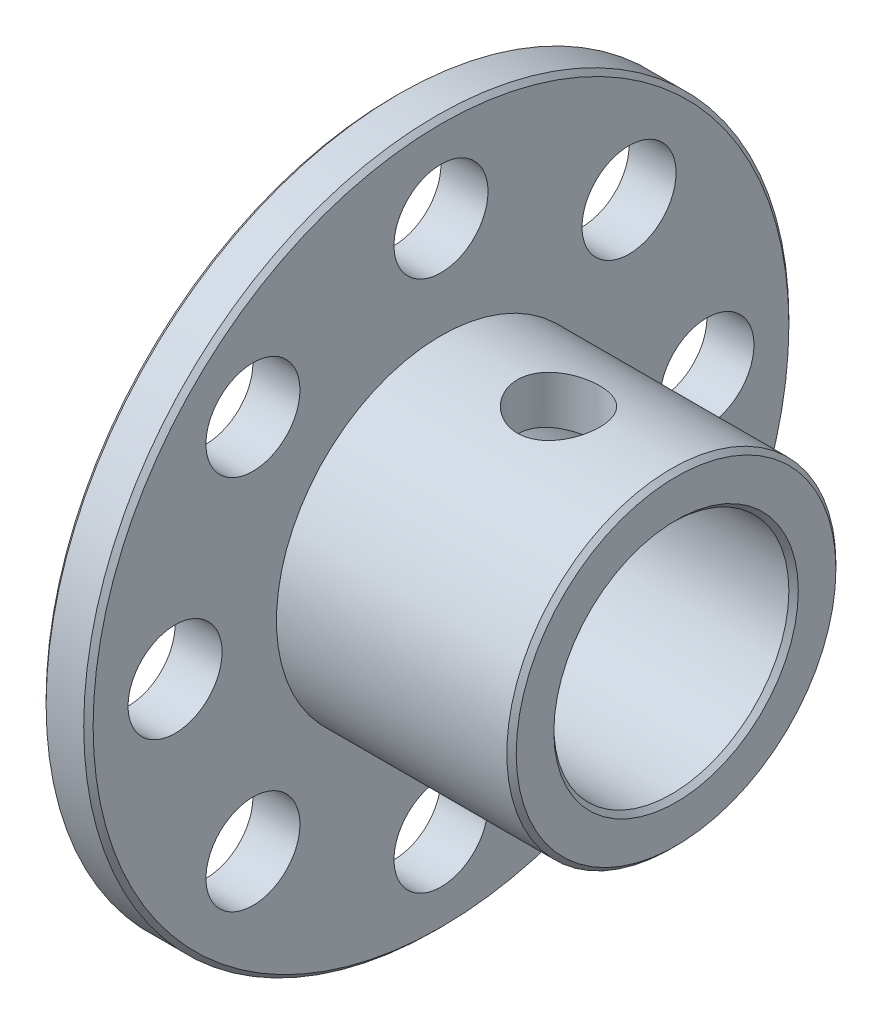
ISO-10303-21;
HEADER;
FILE_DESCRIPTION(('STEP AP214'),'2;1');
FILE_NAME('part.step','',(''),(''),'','','');
FILE_SCHEMA(('AUTOMOTIVE_DESIGN { 1 0 10303 214 1 1 1 1 }'));
ENDSEC;
DATA;
#1=APPLICATION_CONTEXT('core data for automotive mechanical design processes');
#2=APPLICATION_PROTOCOL_DEFINITION('international standard','automotive_design',2000,#1);
#3=PRODUCT_CONTEXT('',#1,'mechanical');
#4=PRODUCT('Part','Part','',(#3));
#5=PRODUCT_RELATED_PRODUCT_CATEGORY('part','',(#4));
#6=PRODUCT_DEFINITION_FORMATION('','',#4);
#7=PRODUCT_DEFINITION_CONTEXT('part definition',#1,'design');
#8=PRODUCT_DEFINITION('design','',#6,#7);
#9=PRODUCT_DEFINITION_SHAPE('','',#8);
#10=(LENGTH_UNIT() NAMED_UNIT(*) SI_UNIT(.MILLI.,.METRE.));
#11=(NAMED_UNIT(*) PLANE_ANGLE_UNIT() SI_UNIT($,.RADIAN.));
#12=(NAMED_UNIT(*) SI_UNIT($,.STERADIAN.) SOLID_ANGLE_UNIT());
#13=UNCERTAINTY_MEASURE_WITH_UNIT(LENGTH_MEASURE(1.E-05),#10,'distance_accuracy_value','');
#14=(GEOMETRIC_REPRESENTATION_CONTEXT(3) GLOBAL_UNCERTAINTY_ASSIGNED_CONTEXT((#13)) GLOBAL_UNIT_ASSIGNED_CONTEXT((#10,
#11,#12)) REPRESENTATION_CONTEXT('',''));
#15=CARTESIAN_POINT('',(0.,0.,0.));
#16=DIRECTION('',(0.,0.,1.));
#17=DIRECTION('',(1.,0.,0.));
#18=AXIS2_PLACEMENT_3D('',#15,#16,#17);
#19=CARTESIAN_POINT('',(12.,0.,0.));
#20=DIRECTION('',(-1.,0.,0.));
#21=DIRECTION('',(0.,0.,1.));
#22=AXIS2_PLACEMENT_3D('',#19,#20,#21);
#23=CYLINDRICAL_SURFACE('',#22,7.);
#24=CARTESIAN_POINT('',(11.8,0.,0.));
#25=DIRECTION('',(1.,0.,0.));
#26=DIRECTION('',(0.,0.,-1.));
#27=AXIS2_PLACEMENT_3D('',#24,#25,#26);
#28=CIRCLE('',#27,7.);
#29=CARTESIAN_POINT('',(11.8,0.,-7.));
#30=VERTEX_POINT('',#29);
#31=EDGE_CURVE('E10',#30,#30,#28,.F.);
#32=ORIENTED_EDGE('',*,*,#31,.T.);
#33=EDGE_LOOP('',(#32));
#34=FACE_BOUND('',#33,.T.);
#35=CARTESIAN_POINT('',(2.,0.,0.));
#36=DIRECTION('',(1.,0.,0.));
#37=DIRECTION('',(0.,0.,-1.));
#38=AXIS2_PLACEMENT_3D('',#35,#36,#37);
#39=CIRCLE('',#38,7.);
#40=CARTESIAN_POINT('',(2.,0.,-7.));
#41=VERTEX_POINT('',#40);
#42=EDGE_CURVE('E84',#41,#41,#39,.T.);
#43=ORIENTED_EDGE('',*,*,#42,.T.);
#44=EDGE_LOOP('',(#43));
#45=FACE_BOUND('',#44,.T.);
#46=CARTESIAN_POINT('',(7.,6.77772085586298,-1.75));
#47=CARTESIAN_POINT('',(6.90336447435277,6.77772270059716,-1.74999725501424));
#48=CARTESIAN_POINT('',(6.8066985709254,6.77981014209739,-1.74196837184811));
#49=CARTESIAN_POINT('',(6.61614269527817,6.78791303395274,-1.7101161878249));
#50=CARTESIAN_POINT('',(6.52225437187217,6.79393077035269,-1.68628369471954));
#51=CARTESIAN_POINT('',(6.34003752326907,6.80917107217177,-1.62364383974236));
#52=CARTESIAN_POINT('',(6.25170199123003,6.81838949883286,-1.58485580949813));
#53=CARTESIAN_POINT('',(6.08278240322206,6.83898734420165,-1.49346479888299));
#54=CARTESIAN_POINT('',(6.00219867654384,6.85036685464951,-1.44086123199249));
#55=CARTESIAN_POINT('',(5.84929684831646,6.87428501448928,-1.32209589911831));
#56=CARTESIAN_POINT('',(5.77717447975497,6.88684218336121,-1.25568582139284));
#57=CARTESIAN_POINT('',(5.64496702394776,6.91154012860708,-1.11172744487047));
#58=CARTESIAN_POINT('',(5.58488306206478,6.92368086596472,-1.03417810592622));
#59=CARTESIAN_POINT('',(5.47765717265811,6.94638290864407,-0.868801640755268));
#60=CARTESIAN_POINT('',(5.43070752828697,6.95691981180414,-0.780846203336584));
#61=CARTESIAN_POINT('',(5.35233324909284,6.97501568348189,-0.597984229004934));
#62=CARTESIAN_POINT('',(5.32090632365914,6.98257509134041,-0.503078720054358));
#63=CARTESIAN_POINT('',(5.27509651579499,6.99373331193726,-0.311051131127913));
#64=CARTESIAN_POINT('',(5.26038124897139,6.9974092569102,-0.214012903684283));
#65=CARTESIAN_POINT('',(5.24736913450711,7.00065515875108,-0.0187801734839383));
#66=CARTESIAN_POINT('',(5.24906985945328,7.00022572267693,0.0794141561766482));
#67=CARTESIAN_POINT('',(5.2686023951751,6.99536666467474,0.271866432551678));
#68=CARTESIAN_POINT('',(5.2860754275377,6.99102601638612,0.366163377301868));
#69=CARTESIAN_POINT('',(5.33607988903395,6.97893585567398,0.550441932973951));
#70=CARTESIAN_POINT('',(5.36861211976419,6.97118616178909,0.640423313898267));
#71=CARTESIAN_POINT('',(5.44810179948094,6.95301256790627,0.814461731128162));
#72=CARTESIAN_POINT('',(5.49518693126322,6.94256513786537,0.898457892091383));
#73=CARTESIAN_POINT('',(5.60234897538138,6.92012932666754,1.05748233909586));
#74=CARTESIAN_POINT('',(5.66242814799243,6.90814067756743,1.13250906139963));
#75=CARTESIAN_POINT('',(5.79579611938766,6.88354599638664,1.27360456139867));
#76=CARTESIAN_POINT('',(5.86939842464344,6.87093203668142,1.3393759383816));
#77=CARTESIAN_POINT('',(6.02671998147818,6.84680530461695,1.45770865793528));
#78=CARTESIAN_POINT('',(6.1104397056437,6.83529258374179,1.51026938308053));
#79=CARTESIAN_POINT('',(6.28620302390428,6.81464347782154,1.60087922578955));
#80=CARTESIAN_POINT('',(6.37828501121924,6.80551888608004,1.63885674219836));
#81=CARTESIAN_POINT('',(6.56780982765352,6.7908304809797,1.6986998361136));
#82=CARTESIAN_POINT('',(6.6652515047882,6.78526590567153,1.72056886146759));
#83=CARTESIAN_POINT('',(6.85997165106619,6.77848749227399,1.74708074706562));
#84=CARTESIAN_POINT('',(6.95718645533074,6.77716262365554,1.75216333174374));
#85=CARTESIAN_POINT('',(7.15107535560471,6.77871140436728,1.74616189336088));
#86=CARTESIAN_POINT('',(7.24774950056587,6.78158466720886,1.73507935849416));
#87=CARTESIAN_POINT('',(7.4361799854683,6.79109957368192,1.69744782475636));
#88=CARTESIAN_POINT('',(7.52799090859959,6.79767879164062,1.67115484779722));
#89=CARTESIAN_POINT('',(7.70590202049618,6.81380502789674,1.60413265716943));
#90=CARTESIAN_POINT('',(7.79200153133874,6.82335239774029,1.56340173339878));
#91=CARTESIAN_POINT('',(7.95790889450715,6.84457295965284,1.46773946755559));
#92=CARTESIAN_POINT('',(8.03756018803017,6.85628418024649,1.41254522768494));
#93=CARTESIAN_POINT('',(8.18663185396095,6.88041958150201,1.2898555126353));
#94=CARTESIAN_POINT('',(8.25605054165505,6.89284387909929,1.22235801590952));
#95=CARTESIAN_POINT('',(8.38446772979967,6.91738182122124,1.07495976172327));
#96=CARTESIAN_POINT('',(8.44316204378417,6.92947991443285,0.994790916930288));
#97=CARTESIAN_POINT('',(8.54625510686587,6.95168051629614,0.825479694715682));
#98=CARTESIAN_POINT('',(8.59065460162575,6.96178312902772,0.736337785675784));
#99=CARTESIAN_POINT('',(8.66351222416955,6.9787908101682,0.552226853029407));
#100=CARTESIAN_POINT('',(8.69208499906534,6.98571881015687,0.457305416798791));
#101=CARTESIAN_POINT('',(8.73282223422589,6.99569705377052,0.263812080557913));
#102=CARTESIAN_POINT('',(8.74498986111734,6.99874804575386,0.165240888822176));
#103=CARTESIAN_POINT('',(8.75239328175719,7.00059796465419,-0.0298961712758213));
#104=CARTESIAN_POINT('',(8.74807799091693,6.99950963040014,-0.126444197190558));
#105=CARTESIAN_POINT('',(8.72366630223492,6.99345318800491,-0.317393118725795));
#106=CARTESIAN_POINT('',(8.70357037372707,6.98848519524916,-0.411794078116552));
#107=CARTESIAN_POINT('',(8.64840861540088,6.97524507494435,-0.59529931237843));
#108=CARTESIAN_POINT('',(8.61342395669941,6.96699087879666,-0.684429365516785));
#109=CARTESIAN_POINT('',(8.52955148671618,6.94804755598422,-0.855604842822572));
#110=CARTESIAN_POINT('',(8.48066192282826,6.93735812241038,-0.937649372213841));
#111=CARTESIAN_POINT('',(8.36899834050512,6.91437686942333,-1.09445337474182));
#112=CARTESIAN_POINT('',(8.30591974991209,6.9020527965482,-1.16899122952602));
#113=CARTESIAN_POINT('',(8.16826000904585,6.87733635843173,-1.3065762854747));
#114=CARTESIAN_POINT('',(8.09367594682866,6.86494397666973,-1.36962056886933));
#115=CARTESIAN_POINT('',(7.93344752514767,6.84123082755959,-1.48358354633865));
#116=CARTESIAN_POINT('',(7.8476227840279,6.82993436527298,-1.53425408403146));
#117=CARTESIAN_POINT('',(7.66840289263527,6.81001922213577,-1.62037206907742));
#118=CARTESIAN_POINT('',(7.5750133093132,6.8013985943173,-1.65583059207951));
#119=CARTESIAN_POINT('',(7.40149022930325,6.78915840294621,-1.70523942498952));
#120=CARTESIAN_POINT('',(7.32218696232824,6.78490160250957,-1.72198804854191));
#121=CARTESIAN_POINT('',(7.16192947925006,6.77918217524751,-1.74436901200322));
#122=CARTESIAN_POINT('',(7.08097540457114,6.77771931007435,-1.75000230015132));
#123=CARTESIAN_POINT('',(7.,6.77772085586298,-1.75));
#124=B_SPLINE_CURVE_WITH_KNOTS('',3,(#46,#47,#48,#49,#50,#51,#52,#53,#54,#55,#56,#57,#58,#59,
#60,#61,#62,#63,#64,#65,#66,#67,#68,#69,#70,#71,#72,#73,#74,#75,#76,#77,#78,#79,#80,#81,#82,#83,
#84,#85,#86,#87,#88,#89,#90,#91,#92,#93,#94,#95,#96,#97,#98,#99,#100,#101,#102,#103,#104,#105,
#106,#107,#108,#109,#110,#111,#112,#113,#114,#115,#116,#117,#118,#119,#120,#121,#122,#123),
.UNSPECIFIED.,.T.,.F.,(4,2,2,2,2,2,2,2,2,2,2,2,2,2,2,2,2,2,2,2,2,2,2,2,2,2,2,2,2,2,2,2,2,2,2,2,
2,2,4),(0.,0.289609209215296,0.579387019000067,0.868791509016214,1.15820828728835,
1.45336767935083,1.74855465035907,2.04786047478544,2.34712211892965,2.64032125696743,
2.93347704066215,3.22012783882263,3.5067938970735,3.79605011978111,4.0853566982824,
4.38249326600338,4.67964371839862,4.97823502405882,5.27676240090684,5.56740502333202,
5.85802089028662,6.14388183506445,6.42977664994993,6.7212799210141,7.01283113219532,
7.31167731675724,7.61050791003688,7.90714450964851,8.20372384236327,8.4922841228922,
8.78083582163887,9.06783413591799,9.35486864016651,9.6487796760745,9.94276522095857,
10.2422353409927,10.5414870495663,10.7841847902413,11.0268618256967),.UNSPECIFIED.);
#125=CARTESIAN_POINT('',(7.,6.77772085586298,-1.75));
#126=VERTEX_POINT('',#125);
#127=EDGE_CURVE('E98',#126,#126,#124,.T.);
#128=ORIENTED_EDGE('',*,*,#127,.F.);
#129=EDGE_LOOP('',(#128));
#130=FACE_BOUND('',#129,.T.);
#131=ADVANCED_FACE('F40',(#34,#45,#130),#23,.T.);
#132=CARTESIAN_POINT('',(0.,0.,0.));
#133=DIRECTION('',(1.,0.,0.));
#134=DIRECTION('',(0.,0.,-1.));
#135=AXIS2_PLACEMENT_3D('',#132,#133,#134);
#136=CYLINDRICAL_SURFACE('',#135,5.);
#137=CARTESIAN_POINT('',(0.199999999999997,0.,0.));
#138=DIRECTION('',(1.,0.,0.));
#139=DIRECTION('',(0.,0.,-1.));
#140=AXIS2_PLACEMENT_3D('',#137,#138,#139);
#141=CIRCLE('',#140,5.);
#142=CARTESIAN_POINT('',(0.199999999999997,0.,-5.));
#143=VERTEX_POINT('',#142);
#144=EDGE_CURVE('E72',#143,#143,#141,.F.);
#145=ORIENTED_EDGE('',*,*,#144,.T.);
#146=EDGE_LOOP('',(#145));
#147=FACE_BOUND('',#146,.T.);
#148=CARTESIAN_POINT('',(11.8,0.,0.));
#149=DIRECTION('',(1.,0.,0.));
#150=DIRECTION('',(0.,0.,-1.));
#151=AXIS2_PLACEMENT_3D('',#148,#149,#150);
#152=CIRCLE('',#151,5.);
#153=CARTESIAN_POINT('',(11.8,0.,-5.));
#154=VERTEX_POINT('',#153);
#155=EDGE_CURVE('E75',#154,#154,#152,.T.);
#156=ORIENTED_EDGE('',*,*,#155,.T.);
#157=EDGE_LOOP('',(#156));
#158=FACE_BOUND('',#157,.T.);
#159=CARTESIAN_POINT('',(7.,4.6837484987988,-1.75));
#160=CARTESIAN_POINT('',(7.09500761422159,4.68374720485959,-1.75000152826706));
#161=CARTESIAN_POINT('',(7.19000458314091,4.68667080692753,-1.74223702845892));
#162=CARTESIAN_POINT('',(7.37716461343902,4.6979805396323,-1.71150284343091));
#163=CARTESIAN_POINT('',(7.46932743868826,4.70636712413873,-1.68853189484273));
#164=CARTESIAN_POINT('',(7.64807334180472,4.72753898808221,-1.6283062855171));
#165=CARTESIAN_POINT('',(7.73466782215253,4.74031491516133,-1.59108197521608));
#166=CARTESIAN_POINT('',(7.90041338370236,4.76881178214549,-1.50351160924169));
#167=CARTESIAN_POINT('',(7.97956256545488,4.78453347053087,-1.45316221737773));
#168=CARTESIAN_POINT('',(8.13158930839132,4.81791171246093,-1.33844146982531));
#169=CARTESIAN_POINT('',(8.20409892191865,4.83561998092638,-1.27359743759365));
#170=CARTESIAN_POINT('',(8.33746874701664,4.87054126917138,-1.13273458125577));
#171=CARTESIAN_POINT('',(8.39832686385414,4.88775419942611,-1.0567137520941));
#172=CARTESIAN_POINT('',(8.50837506445997,4.92035027857299,-0.892925093026126));
#173=CARTESIAN_POINT('',(8.55717404503811,4.93566559950246,-0.804879787036822));
#174=CARTESIAN_POINT('',(8.63911980887428,4.96212680122129,-0.621200717106748));
#175=CARTESIAN_POINT('',(8.67227127320395,4.9732739287493,-0.525569232640716));
#176=CARTESIAN_POINT('',(8.72071678873821,4.98977617197834,-0.333294441128111));
#177=CARTESIAN_POINT('',(8.73664237252604,4.99533555255298,-0.236828119050402));
#178=CARTESIAN_POINT('',(8.75219808765962,5.00076407475328,-0.04244280107191));
#179=CARTESIAN_POINT('',(8.75183284077755,5.00063483026419,0.055475774937996));
#180=CARTESIAN_POINT('',(8.73520519182723,4.99483582345016,0.245494270684969));
#181=CARTESIAN_POINT('',(8.71962998483085,4.98940556776971,0.337662857195483));
#182=CARTESIAN_POINT('',(8.67416848603872,4.97392058678691,0.517984230962894));
#183=CARTESIAN_POINT('',(8.64428120244466,4.96386554099777,0.606136739449907));
#184=CARTESIAN_POINT('',(8.57067534839432,4.9399693484705,0.77735741590894));
#185=CARTESIAN_POINT('',(8.52677187399854,4.92607794289925,0.860338791740317));
#186=CARTESIAN_POINT('',(8.42653627333802,4.89593962051638,1.01795058700635));
#187=CARTESIAN_POINT('',(8.37020045541453,4.87969200454427,1.09257851602779));
#188=CARTESIAN_POINT('',(8.24329392655092,4.84555061636556,1.23543995953404));
#189=CARTESIAN_POINT('',(8.17213898247868,4.82761516171595,1.30314530587507));
#190=CARTESIAN_POINT('',(8.01934800811676,4.79281181598576,1.42584439192424));
#191=CARTESIAN_POINT('',(7.93771000372369,4.77594412687552,1.4808357319351));
#192=CARTESIAN_POINT('',(7.76443996544408,4.74494411656163,1.57738076604105));
#193=CARTESIAN_POINT('',(7.67266068849562,4.7308636022452,1.61868813477292));
#194=CARTESIAN_POINT('',(7.48282932574561,4.70762977262316,1.68507378723152));
#195=CARTESIAN_POINT('',(7.38478021990772,4.69847413578168,1.71015971870381));
#196=CARTESIAN_POINT('',(7.19035162521503,4.68666052959585,1.74226665309119));
#197=CARTESIAN_POINT('',(7.09412680119734,4.68370541076474,1.75011468633883));
#198=CARTESIAN_POINT('',(6.9017104197443,4.68379251162851,1.74988283838022));
#199=CARTESIAN_POINT('',(6.805518859542,4.68683349358072,1.74180624440865));
#200=CARTESIAN_POINT('',(6.61984094081944,4.69827167763639,1.71070041976783));
#201=CARTESIAN_POINT('',(6.53023956653699,4.70645413390635,1.68827004723643));
#202=CARTESIAN_POINT('',(6.35609846552123,4.72700986323119,1.62982534360075));
#203=CARTESIAN_POINT('',(6.27155969579549,4.73938392572043,1.59380845350784));
#204=CARTESIAN_POINT('',(6.10674527791478,4.76744975837994,1.50782257741686));
#205=CARTESIAN_POINT('',(6.02671323581484,4.78324025669695,1.45741978475385));
#206=CARTESIAN_POINT('',(5.87594577571804,4.81617843481946,1.34457250316525));
#207=CARTESIAN_POINT('',(5.80521337583498,4.83332655234923,1.28212412109629));
#208=CARTESIAN_POINT('',(5.67110635728791,4.86816559512971,1.14296623724276));
#209=CARTESIAN_POINT('',(5.60833390367782,4.8858359511495,1.06566944246506));
#210=CARTESIAN_POINT('',(5.49659909867076,4.91882686414116,0.901202968061243));
#211=CARTESIAN_POINT('',(5.44763642642726,4.93414747570151,0.814033517875271));
#212=CARTESIAN_POINT('',(5.36532286955579,4.96066068118222,0.632608081715854));
#213=CARTESIAN_POINT('',(5.33188514483698,4.97187616093787,0.538395022683095));
#214=CARTESIAN_POINT('',(5.28148720951612,4.98900968413634,0.34520737503469));
#215=CARTESIAN_POINT('',(5.26452036716228,4.99492985957784,0.246234719659117));
#216=CARTESIAN_POINT('',(5.24818979369822,5.00062864866872,0.0518184418761767));
#217=CARTESIAN_POINT('',(5.24796543576391,5.00070752541974,-0.0435448173803394));
#218=CARTESIAN_POINT('',(5.26296804812376,4.99547100210103,-0.232887536964351));
#219=CARTESIAN_POINT('',(5.27819354132096,4.99015611770669,-0.326867128707225));
#220=CARTESIAN_POINT('',(5.32307734593306,4.97485061583987,-0.508981819704918));
#221=CARTESIAN_POINT('',(5.35245598991649,4.9649507389044,-0.597194029730129));
#222=CARTESIAN_POINT('',(5.42454635492223,4.9414973575352,-0.767462013569871));
#223=CARTESIAN_POINT('',(5.46726055472777,4.92794317391108,-0.849516639306428));
#224=CARTESIAN_POINT('',(5.56672719148091,4.89790160847887,-1.00865029316432));
#225=CARTESIAN_POINT('',(5.62396394049503,4.88132013454011,-1.08540856336539));
#226=CARTESIAN_POINT('',(5.75005133281321,4.84728694910474,-1.22850678053987));
#227=CARTESIAN_POINT('',(5.81890586807981,4.82983494736559,-1.29484322176797));
#228=CARTESIAN_POINT('',(5.96991854510733,4.79509560795335,-1.41822148526311));
#229=CARTESIAN_POINT('',(6.05253133304346,4.77784991480602,-1.47472048014341));
#230=CARTESIAN_POINT('',(6.22662385715822,4.74639844695308,-1.57301525999125));
#231=CARTESIAN_POINT('',(6.31810244381809,4.73219227891386,-1.61481294785143));
#232=CARTESIAN_POINT('',(6.50640214846905,4.70877102027301,-1.68188417056926));
#233=CARTESIAN_POINT('',(6.60315281327464,4.69950235516208,-1.70733571976716));
#234=CARTESIAN_POINT('',(6.79994058266308,4.68699312905296,-1.74138904665236));
#235=CARTESIAN_POINT('',(6.8999761908689,4.68374986105518,-1.74999839104377));
#236=CARTESIAN_POINT('',(7.,4.6837484987988,-1.75));
#237=B_SPLINE_CURVE_WITH_KNOTS('',3,(#159,#160,#161,#162,#163,#164,#165,#166,#167,#168,#169,
#170,#171,#172,#173,#174,#175,#176,#177,#178,#179,#180,#181,#182,#183,#184,#185,#186,#187,#188,
#189,#190,#191,#192,#193,#194,#195,#196,#197,#198,#199,#200,#201,#202,#203,#204,#205,#206,#207,
#208,#209,#210,#211,#212,#213,#214,#215,#216,#217,#218,#219,#220,#221,#222,#223,#224,#225,#226,
#227,#228,#229,#230,#231,#232,#233,#234,#235,#236),.UNSPECIFIED.,.T.,.F.,(4,2,2,2,2,2,2,2,2,2,2,
2,2,2,2,2,2,2,2,2,2,2,2,2,2,2,2,2,2,2,2,2,2,2,2,2,2,2,4),(0.,0.284651635594199,
0.569326923324705,0.853399377903851,1.13754410978839,1.43283816033969,1.728185249792,
2.03212748646944,2.335978738831,2.62826736544509,2.92047306916393,3.20005995651959,
3.47966622149221,3.76312511804984,4.04666829838924,4.34483254952085,4.64305303162079,
4.9463820695136,5.24956799567808,5.5378573918587,5.82608728424852,6.10301294372741,
6.37999078756695,6.66641167236913,6.95292528419449,7.25488366573244,7.55683503120822,
7.85707643107363,8.15719689307681,8.44187881225603,8.72653351672762,9.00578077768927,
9.28507997544029,9.57531854538556,9.86565453910385,10.1688694665245,10.4720451322684,
10.7718604827926,11.0715411041912),.UNSPECIFIED.);
#238=CARTESIAN_POINT('',(7.,4.6837484987988,-1.75));
#239=VERTEX_POINT('',#238);
#240=EDGE_CURVE('E45',#239,#239,#237,.T.);
#241=ORIENTED_EDGE('',*,*,#240,.F.);
#242=EDGE_LOOP('',(#241));
#243=FACE_BOUND('',#242,.T.);
#244=ADVANCED_FACE('F148',(#147,#158,#243),#136,.F.);
#245=CARTESIAN_POINT('',(2.,0.,0.));
#246=DIRECTION('',(-1.,0.,0.));
#247=DIRECTION('',(0.,0.,1.));
#248=AXIS2_PLACEMENT_3D('',#245,#246,#247);
#249=CYLINDRICAL_SURFACE('',#248,15.);
#250=CARTESIAN_POINT('',(1.79999999999999,0.,0.));
#251=DIRECTION('',(1.,0.,0.));
#252=DIRECTION('',(0.,0.,-1.));
#253=AXIS2_PLACEMENT_3D('',#250,#251,#252);
#254=CIRCLE('',#253,15.);
#255=CARTESIAN_POINT('',(1.79999999999999,0.,-15.));
#256=VERTEX_POINT('',#255);
#257=EDGE_CURVE('E63',#256,#256,#254,.F.);
#258=ORIENTED_EDGE('',*,*,#257,.T.);
#259=EDGE_LOOP('',(#258));
#260=FACE_BOUND('',#259,.T.);
#261=CARTESIAN_POINT('',(0.200000000000001,0.,0.));
#262=DIRECTION('',(1.,0.,0.));
#263=DIRECTION('',(0.,0.,-1.));
#264=AXIS2_PLACEMENT_3D('',#261,#262,#263);
#265=CIRCLE('',#264,15.);
#266=CARTESIAN_POINT('',(0.200000000000001,0.,-15.));
#267=VERTEX_POINT('',#266);
#268=EDGE_CURVE('E66',#267,#267,#265,.T.);
#269=ORIENTED_EDGE('',*,*,#268,.T.);
#270=EDGE_LOOP('',(#269));
#271=FACE_BOUND('',#270,.T.);
#272=ADVANCED_FACE('F153',(#260,#271),#249,.T.);
#273=CARTESIAN_POINT('',(2.,0.,0.));
#274=DIRECTION('',(1.,0.,0.));
#275=DIRECTION('',(0.,0.,-1.));
#276=AXIS2_PLACEMENT_3D('',#273,#274,#275);
#277=PLANE('',#276);
#278=CARTESIAN_POINT('',(2.,0.,0.));
#279=DIRECTION('',(1.,0.,0.));
#280=DIRECTION('',(0.,0.,-1.));
#281=AXIS2_PLACEMENT_3D('',#278,#279,#280);
#282=CIRCLE('',#281,14.8);
#283=CARTESIAN_POINT('',(2.,0.,-14.8));
#284=VERTEX_POINT('',#283);
#285=EDGE_CURVE('E69',#284,#284,#282,.T.);
#286=ORIENTED_EDGE('',*,*,#285,.T.);
#287=EDGE_LOOP('',(#286));
#288=FACE_BOUND('',#287,.T.);
#289=CARTESIAN_POINT('',(2.,8.0000000000001,7.9999999999999));
#290=DIRECTION('',(1.,0.,0.));
#291=DIRECTION('',(0.,0.,-1.));
#292=AXIS2_PLACEMENT_3D('',#289,#290,#291);
#293=CIRCLE('',#292,2.);
#294=CARTESIAN_POINT('',(2.,8.0000000000001,5.9999999999999));
#295=VERTEX_POINT('',#294);
#296=EDGE_CURVE('E94',#295,#295,#293,.T.);
#297=ORIENTED_EDGE('',*,*,#296,.F.);
#298=EDGE_LOOP('',(#297));
#299=FACE_BOUND('',#298,.T.);
#300=CARTESIAN_POINT('',(2.,0.,11.3137084989847));
#301=DIRECTION('',(1.,0.,0.));
#302=DIRECTION('',(0.,0.,-1.));
#303=AXIS2_PLACEMENT_3D('',#300,#301,#302);
#304=CIRCLE('',#303,2.);
#305=CARTESIAN_POINT('',(2.,0.,9.31370849898468));
#306=VERTEX_POINT('',#305);
#307=EDGE_CURVE('E101',#306,#306,#304,.T.);
#308=ORIENTED_EDGE('',*,*,#307,.F.);
#309=EDGE_LOOP('',(#308));
#310=FACE_BOUND('',#309,.T.);
#311=CARTESIAN_POINT('',(2.,-7.99999999999986,7.99999999999994));
#312=DIRECTION('',(1.,0.,0.));
#313=DIRECTION('',(0.,0.,-1.));
#314=AXIS2_PLACEMENT_3D('',#311,#312,#313);
#315=CIRCLE('',#314,2.);
#316=CARTESIAN_POINT('',(2.,-7.99999999999986,5.99999999999994));
#317=VERTEX_POINT('',#316);
#318=EDGE_CURVE('E107',#317,#317,#315,.T.);
#319=ORIENTED_EDGE('',*,*,#318,.F.);
#320=EDGE_LOOP('',(#319));
#321=FACE_BOUND('',#320,.T.);
#322=CARTESIAN_POINT('',(2.,-11.3137084989846,0.));
#323=DIRECTION('',(1.,0.,0.));
#324=DIRECTION('',(0.,0.,-1.));
#325=AXIS2_PLACEMENT_3D('',#322,#323,#324);
#326=CIRCLE('',#325,2.);
#327=CARTESIAN_POINT('',(2.,-11.3137084989846,-2.));
#328=VERTEX_POINT('',#327);
#329=EDGE_CURVE('E113',#328,#328,#326,.T.);
#330=ORIENTED_EDGE('',*,*,#329,.F.);
#331=EDGE_LOOP('',(#330));
#332=FACE_BOUND('',#331,.T.);
#333=CARTESIAN_POINT('',(2.,-7.99999999999986,-7.99999999999994));
#334=DIRECTION('',(1.,0.,0.));
#335=DIRECTION('',(0.,0.,-1.));
#336=AXIS2_PLACEMENT_3D('',#333,#334,#335);
#337=CIRCLE('',#336,2.);
#338=CARTESIAN_POINT('',(2.,-7.99999999999986,-9.99999999999994));
#339=VERTEX_POINT('',#338);
#340=EDGE_CURVE('E119',#339,#339,#337,.T.);
#341=ORIENTED_EDGE('',*,*,#340,.F.);
#342=EDGE_LOOP('',(#341));
#343=FACE_BOUND('',#342,.T.);
#344=CARTESIAN_POINT('',(2.,0.,-11.3137084989847));
#345=DIRECTION('',(1.,0.,0.));
#346=DIRECTION('',(0.,0.,-1.));
#347=AXIS2_PLACEMENT_3D('',#344,#345,#346);
#348=CIRCLE('',#347,2.);
#349=CARTESIAN_POINT('',(2.,0.,-13.3137084989847));
#350=VERTEX_POINT('',#349);
#351=EDGE_CURVE('E125',#350,#350,#348,.T.);
#352=ORIENTED_EDGE('',*,*,#351,.F.);
#353=EDGE_LOOP('',(#352));
#354=FACE_BOUND('',#353,.T.);
#355=CARTESIAN_POINT('',(2.,7.99999999999999,-8.00000000000001));
#356=DIRECTION('',(1.,0.,0.));
#357=DIRECTION('',(0.,0.,-1.));
#358=AXIS2_PLACEMENT_3D('',#355,#356,#357);
#359=CIRCLE('',#358,2.);
#360=CARTESIAN_POINT('',(2.,7.99999999999999,-10.));
#361=VERTEX_POINT('',#360);
#362=EDGE_CURVE('E131',#361,#361,#359,.T.);
#363=ORIENTED_EDGE('',*,*,#362,.F.);
#364=EDGE_LOOP('',(#363));
#365=FACE_BOUND('',#364,.T.);
#366=CARTESIAN_POINT('',(2.,11.3137084989848,0.));
#367=DIRECTION('',(1.,0.,0.));
#368=DIRECTION('',(0.,0.,-1.));
#369=AXIS2_PLACEMENT_3D('',#366,#367,#368);
#370=CIRCLE('',#369,2.);
#371=CARTESIAN_POINT('',(2.,11.3137084989848,-2.));
#372=VERTEX_POINT('',#371);
#373=EDGE_CURVE('E88',#372,#372,#370,.T.);
#374=ORIENTED_EDGE('',*,*,#373,.F.);
#375=EDGE_LOOP('',(#374));
#376=FACE_BOUND('',#375,.T.);
#377=ORIENTED_EDGE('',*,*,#42,.F.);
#378=EDGE_LOOP('',(#377));
#379=FACE_BOUND('',#378,.T.);
#380=ADVANCED_FACE('F194',(#288,#299,#310,#321,#332,#343,#354,#365,#376,#379),#277,.T.);
#381=CARTESIAN_POINT('',(0.,0.,0.));
#382=DIRECTION('',(1.,0.,0.));
#383=DIRECTION('',(0.,0.,-1.));
#384=AXIS2_PLACEMENT_3D('',#381,#382,#383);
#385=PLANE('',#384);
#386=CARTESIAN_POINT('',(0.,0.,0.));
#387=DIRECTION('',(1.,0.,0.));
#388=DIRECTION('',(0.,0.,-1.));
#389=AXIS2_PLACEMENT_3D('',#386,#387,#388);
#390=CIRCLE('',#389,5.2);
#391=CARTESIAN_POINT('',(0.,0.,-5.2));
#392=VERTEX_POINT('',#391);
#393=EDGE_CURVE('E78',#392,#392,#390,.T.);
#394=ORIENTED_EDGE('',*,*,#393,.T.);
#395=EDGE_LOOP('',(#394));
#396=FACE_BOUND('',#395,.T.);
#397=CARTESIAN_POINT('',(0.,0.,0.));
#398=DIRECTION('',(1.,0.,0.));
#399=DIRECTION('',(0.,0.,-1.));
#400=AXIS2_PLACEMENT_3D('',#397,#398,#399);
#401=CIRCLE('',#400,14.8);
#402=CARTESIAN_POINT('',(0.,0.,-14.8));
#403=VERTEX_POINT('',#402);
#404=EDGE_CURVE('E81',#403,#403,#401,.F.);
#405=ORIENTED_EDGE('',*,*,#404,.T.);
#406=EDGE_LOOP('',(#405));
#407=FACE_BOUND('',#406,.T.);
#408=CARTESIAN_POINT('',(0.,8.0000000000001,7.9999999999999));
#409=DIRECTION('',(1.,0.,0.));
#410=DIRECTION('',(0.,0.,-1.));
#411=AXIS2_PLACEMENT_3D('',#408,#409,#410);
#412=CIRCLE('',#411,2.);
#413=CARTESIAN_POINT('',(0.,8.0000000000001,5.9999999999999));
#414=VERTEX_POINT('',#413);
#415=EDGE_CURVE('E97',#414,#414,#412,.T.);
#416=ORIENTED_EDGE('',*,*,#415,.T.);
#417=EDGE_LOOP('',(#416));
#418=FACE_BOUND('',#417,.T.);
#419=CARTESIAN_POINT('',(0.,0.,11.3137084989847));
#420=DIRECTION('',(1.,0.,0.));
#421=DIRECTION('',(0.,0.,-1.));
#422=AXIS2_PLACEMENT_3D('',#419,#420,#421);
#423=CIRCLE('',#422,2.);
#424=CARTESIAN_POINT('',(0.,0.,9.31370849898468));
#425=VERTEX_POINT('',#424);
#426=EDGE_CURVE('E104',#425,#425,#423,.T.);
#427=ORIENTED_EDGE('',*,*,#426,.T.);
#428=EDGE_LOOP('',(#427));
#429=FACE_BOUND('',#428,.T.);
#430=CARTESIAN_POINT('',(0.,-7.99999999999986,7.99999999999994));
#431=DIRECTION('',(1.,0.,0.));
#432=DIRECTION('',(0.,0.,-1.));
#433=AXIS2_PLACEMENT_3D('',#430,#431,#432);
#434=CIRCLE('',#433,2.);
#435=CARTESIAN_POINT('',(0.,-7.99999999999986,5.99999999999994));
#436=VERTEX_POINT('',#435);
#437=EDGE_CURVE('E110',#436,#436,#434,.T.);
#438=ORIENTED_EDGE('',*,*,#437,.T.);
#439=EDGE_LOOP('',(#438));
#440=FACE_BOUND('',#439,.T.);
#441=CARTESIAN_POINT('',(0.,-11.3137084989846,0.));
#442=DIRECTION('',(1.,0.,0.));
#443=DIRECTION('',(0.,0.,-1.));
#444=AXIS2_PLACEMENT_3D('',#441,#442,#443);
#445=CIRCLE('',#444,2.);
#446=CARTESIAN_POINT('',(0.,-11.3137084989846,-2.));
#447=VERTEX_POINT('',#446);
#448=EDGE_CURVE('E116',#447,#447,#445,.T.);
#449=ORIENTED_EDGE('',*,*,#448,.T.);
#450=EDGE_LOOP('',(#449));
#451=FACE_BOUND('',#450,.T.);
#452=CARTESIAN_POINT('',(0.,-7.99999999999986,-7.99999999999994));
#453=DIRECTION('',(1.,0.,0.));
#454=DIRECTION('',(0.,0.,-1.));
#455=AXIS2_PLACEMENT_3D('',#452,#453,#454);
#456=CIRCLE('',#455,2.);
#457=CARTESIAN_POINT('',(0.,-7.99999999999986,-9.99999999999994));
#458=VERTEX_POINT('',#457);
#459=EDGE_CURVE('E122',#458,#458,#456,.T.);
#460=ORIENTED_EDGE('',*,*,#459,.T.);
#461=EDGE_LOOP('',(#460));
#462=FACE_BOUND('',#461,.T.);
#463=CARTESIAN_POINT('',(0.,0.,-11.3137084989847));
#464=DIRECTION('',(1.,0.,0.));
#465=DIRECTION('',(0.,0.,-1.));
#466=AXIS2_PLACEMENT_3D('',#463,#464,#465);
#467=CIRCLE('',#466,2.);
#468=CARTESIAN_POINT('',(0.,0.,-13.3137084989847));
#469=VERTEX_POINT('',#468);
#470=EDGE_CURVE('E128',#469,#469,#467,.T.);
#471=ORIENTED_EDGE('',*,*,#470,.T.);
#472=EDGE_LOOP('',(#471));
#473=FACE_BOUND('',#472,.T.);
#474=CARTESIAN_POINT('',(0.,7.99999999999999,-8.00000000000001));
#475=DIRECTION('',(1.,0.,0.));
#476=DIRECTION('',(0.,0.,-1.));
#477=AXIS2_PLACEMENT_3D('',#474,#475,#476);
#478=CIRCLE('',#477,2.);
#479=CARTESIAN_POINT('',(0.,7.99999999999999,-10.));
#480=VERTEX_POINT('',#479);
#481=EDGE_CURVE('E91',#480,#480,#478,.T.);
#482=ORIENTED_EDGE('',*,*,#481,.T.);
#483=EDGE_LOOP('',(#482));
#484=FACE_BOUND('',#483,.T.);
#485=CARTESIAN_POINT('',(0.,11.3137084989848,0.));
#486=DIRECTION('',(1.,0.,0.));
#487=DIRECTION('',(0.,0.,-1.));
#488=AXIS2_PLACEMENT_3D('',#485,#486,#487);
#489=CIRCLE('',#488,2.);
#490=CARTESIAN_POINT('',(0.,11.3137084989848,-2.));
#491=VERTEX_POINT('',#490);
#492=EDGE_CURVE('E87',#491,#491,#489,.T.);
#493=ORIENTED_EDGE('',*,*,#492,.T.);
#494=EDGE_LOOP('',(#493));
#495=FACE_BOUND('',#494,.T.);
#496=ADVANCED_FACE('F189',(#396,#407,#418,#429,#440,#451,#462,#473,#484,#495),#385,.F.);
#497=CARTESIAN_POINT('',(12.,0.,0.));
#498=DIRECTION('',(1.,0.,0.));
#499=DIRECTION('',(0.,0.,-1.));
#500=AXIS2_PLACEMENT_3D('',#497,#498,#499);
#501=PLANE('',#500);
#502=CARTESIAN_POINT('',(12.,0.,0.));
#503=DIRECTION('',(1.,0.,0.));
#504=DIRECTION('',(0.,0.,-1.));
#505=AXIS2_PLACEMENT_3D('',#502,#503,#504);
#506=CIRCLE('',#505,5.2);
#507=CARTESIAN_POINT('',(12.,0.,-5.2));
#508=VERTEX_POINT('',#507);
#509=EDGE_CURVE('E54',#508,#508,#506,.F.);
#510=ORIENTED_EDGE('',*,*,#509,.T.);
#511=EDGE_LOOP('',(#510));
#512=FACE_BOUND('',#511,.T.);
#513=CARTESIAN_POINT('',(12.,0.,0.));
#514=DIRECTION('',(1.,0.,0.));
#515=DIRECTION('',(0.,0.,-1.));
#516=AXIS2_PLACEMENT_3D('',#513,#514,#515);
#517=CIRCLE('',#516,6.8);
#518=CARTESIAN_POINT('',(12.,0.,-6.8));
#519=VERTEX_POINT('',#518);
#520=EDGE_CURVE('E58',#519,#519,#517,.T.);
#521=ORIENTED_EDGE('',*,*,#520,.T.);
#522=EDGE_LOOP('',(#521));
#523=FACE_BOUND('',#522,.T.);
#524=ADVANCED_FACE('F186',(#512,#523),#501,.T.);
#525=CARTESIAN_POINT('',(0.,11.3137084989848,0.));
#526=DIRECTION('',(1.,0.,0.));
#527=DIRECTION('',(0.,0.,-1.));
#528=AXIS2_PLACEMENT_3D('',#525,#526,#527);
#529=CYLINDRICAL_SURFACE('',#528,2.);
#530=ORIENTED_EDGE('',*,*,#492,.F.);
#531=EDGE_LOOP('',(#530));
#532=FACE_BOUND('',#531,.T.);
#533=ORIENTED_EDGE('',*,*,#373,.T.);
#534=EDGE_LOOP('',(#533));
#535=FACE_BOUND('',#534,.T.);
#536=ADVANCED_FACE('F159',(#532,#535),#529,.F.);
#537=CARTESIAN_POINT('',(0.,7.99999999999999,-8.00000000000001));
#538=DIRECTION('',(1.,0.,0.));
#539=DIRECTION('',(0.,0.,-1.));
#540=AXIS2_PLACEMENT_3D('',#537,#538,#539);
#541=CYLINDRICAL_SURFACE('',#540,2.);
#542=ORIENTED_EDGE('',*,*,#481,.F.);
#543=EDGE_LOOP('',(#542));
#544=FACE_BOUND('',#543,.T.);
#545=ORIENTED_EDGE('',*,*,#362,.T.);
#546=EDGE_LOOP('',(#545));
#547=FACE_BOUND('',#546,.T.);
#548=ADVANCED_FACE('F155',(#544,#547),#541,.F.);
#549=CARTESIAN_POINT('',(0.,0.,-11.3137084989847));
#550=DIRECTION('',(1.,0.,0.));
#551=DIRECTION('',(0.,0.,-1.));
#552=AXIS2_PLACEMENT_3D('',#549,#550,#551);
#553=CYLINDRICAL_SURFACE('',#552,2.);
#554=ORIENTED_EDGE('',*,*,#470,.F.);
#555=EDGE_LOOP('',(#554));
#556=FACE_BOUND('',#555,.T.);
#557=ORIENTED_EDGE('',*,*,#351,.T.);
#558=EDGE_LOOP('',(#557));
#559=FACE_BOUND('',#558,.T.);
#560=ADVANCED_FACE('F158',(#556,#559),#553,.F.);
#561=CARTESIAN_POINT('',(0.,-7.99999999999986,-7.99999999999994));
#562=DIRECTION('',(1.,0.,0.));
#563=DIRECTION('',(0.,0.,-1.));
#564=AXIS2_PLACEMENT_3D('',#561,#562,#563);
#565=CYLINDRICAL_SURFACE('',#564,2.);
#566=ORIENTED_EDGE('',*,*,#459,.F.);
#567=EDGE_LOOP('',(#566));
#568=FACE_BOUND('',#567,.T.);
#569=ORIENTED_EDGE('',*,*,#340,.T.);
#570=EDGE_LOOP('',(#569));
#571=FACE_BOUND('',#570,.T.);
#572=ADVANCED_FACE('F163',(#568,#571),#565,.F.);
#573=CARTESIAN_POINT('',(0.,-11.3137084989846,0.));
#574=DIRECTION('',(1.,0.,0.));
#575=DIRECTION('',(0.,0.,-1.));
#576=AXIS2_PLACEMENT_3D('',#573,#574,#575);
#577=CYLINDRICAL_SURFACE('',#576,2.);
#578=ORIENTED_EDGE('',*,*,#448,.F.);
#579=EDGE_LOOP('',(#578));
#580=FACE_BOUND('',#579,.T.);
#581=ORIENTED_EDGE('',*,*,#329,.T.);
#582=EDGE_LOOP('',(#581));
#583=FACE_BOUND('',#582,.T.);
#584=ADVANCED_FACE('F167',(#580,#583),#577,.F.);
#585=CARTESIAN_POINT('',(0.,-7.99999999999986,7.99999999999994));
#586=DIRECTION('',(1.,0.,0.));
#587=DIRECTION('',(0.,0.,-1.));
#588=AXIS2_PLACEMENT_3D('',#585,#586,#587);
#589=CYLINDRICAL_SURFACE('',#588,2.);
#590=ORIENTED_EDGE('',*,*,#437,.F.);
#591=EDGE_LOOP('',(#590));
#592=FACE_BOUND('',#591,.T.);
#593=ORIENTED_EDGE('',*,*,#318,.T.);
#594=EDGE_LOOP('',(#593));
#595=FACE_BOUND('',#594,.T.);
#596=ADVANCED_FACE('F171',(#592,#595),#589,.F.);
#597=CARTESIAN_POINT('',(0.,0.,11.3137084989847));
#598=DIRECTION('',(1.,0.,0.));
#599=DIRECTION('',(0.,0.,-1.));
#600=AXIS2_PLACEMENT_3D('',#597,#598,#599);
#601=CYLINDRICAL_SURFACE('',#600,2.);
#602=ORIENTED_EDGE('',*,*,#426,.F.);
#603=EDGE_LOOP('',(#602));
#604=FACE_BOUND('',#603,.T.);
#605=ORIENTED_EDGE('',*,*,#307,.T.);
#606=EDGE_LOOP('',(#605));
#607=FACE_BOUND('',#606,.T.);
#608=ADVANCED_FACE('F175',(#604,#607),#601,.F.);
#609=CARTESIAN_POINT('',(0.,8.0000000000001,7.9999999999999));
#610=DIRECTION('',(1.,0.,0.));
#611=DIRECTION('',(0.,0.,-1.));
#612=AXIS2_PLACEMENT_3D('',#609,#610,#611);
#613=CYLINDRICAL_SURFACE('',#612,2.);
#614=ORIENTED_EDGE('',*,*,#415,.F.);
#615=EDGE_LOOP('',(#614));
#616=FACE_BOUND('',#615,.T.);
#617=ORIENTED_EDGE('',*,*,#296,.T.);
#618=EDGE_LOOP('',(#617));
#619=FACE_BOUND('',#618,.T.);
#620=ADVANCED_FACE('F179',(#616,#619),#613,.F.);
#621=CARTESIAN_POINT('',(0.,0.,0.));
#622=DIRECTION('',(-1.,0.,0.));
#623=DIRECTION('',(0.,0.,1.));
#624=AXIS2_PLACEMENT_3D('',#621,#622,#623);
#625=CONICAL_SURFACE('',#624,5.2,0.785398163397446);
#626=ORIENTED_EDGE('',*,*,#144,.F.);
#627=EDGE_LOOP('',(#626));
#628=FACE_BOUND('',#627,.T.);
#629=ORIENTED_EDGE('',*,*,#393,.F.);
#630=EDGE_LOOP('',(#629));
#631=FACE_BOUND('',#630,.T.);
#632=ADVANCED_FACE('F183',(#628,#631),#625,.F.);
#633=CARTESIAN_POINT('',(2.,0.,0.));
#634=DIRECTION('',(-1.,0.,0.));
#635=DIRECTION('',(0.,0.,1.));
#636=AXIS2_PLACEMENT_3D('',#633,#634,#635);
#637=CONICAL_SURFACE('',#636,14.8,0.785398163397457);
#638=ORIENTED_EDGE('',*,*,#257,.F.);
#639=EDGE_LOOP('',(#638));
#640=FACE_BOUND('',#639,.T.);
#641=ORIENTED_EDGE('',*,*,#285,.F.);
#642=EDGE_LOOP('',(#641));
#643=FACE_BOUND('',#642,.T.);
#644=ADVANCED_FACE('F222',(#640,#643),#637,.T.);
#645=CARTESIAN_POINT('',(0.200000000000001,0.,0.));
#646=DIRECTION('',(1.,0.,0.));
#647=DIRECTION('',(0.,0.,-1.));
#648=AXIS2_PLACEMENT_3D('',#645,#646,#647);
#649=CONICAL_SURFACE('',#648,15.,0.785398163397448);
#650=ORIENTED_EDGE('',*,*,#404,.F.);
#651=EDGE_LOOP('',(#650));
#652=FACE_BOUND('',#651,.T.);
#653=ORIENTED_EDGE('',*,*,#268,.F.);
#654=EDGE_LOOP('',(#653));
#655=FACE_BOUND('',#654,.T.);
#656=ADVANCED_FACE('F229',(#652,#655),#649,.T.);
#657=CARTESIAN_POINT('',(11.8,0.,0.));
#658=DIRECTION('',(1.,0.,0.));
#659=DIRECTION('',(0.,0.,-1.));
#660=AXIS2_PLACEMENT_3D('',#657,#658,#659);
#661=CONICAL_SURFACE('',#660,5.,0.78539816339745);
#662=ORIENTED_EDGE('',*,*,#509,.F.);
#663=EDGE_LOOP('',(#662));
#664=FACE_BOUND('',#663,.T.);
#665=ORIENTED_EDGE('',*,*,#155,.F.);
#666=EDGE_LOOP('',(#665));
#667=FACE_BOUND('',#666,.T.);
#668=ADVANCED_FACE('F235',(#664,#667),#661,.F.);
#669=CARTESIAN_POINT('',(12.,0.,0.));
#670=DIRECTION('',(-1.,0.,0.));
#671=DIRECTION('',(0.,0.,1.));
#672=AXIS2_PLACEMENT_3D('',#669,#670,#671);
#673=CONICAL_SURFACE('',#672,6.8,0.785398163397459);
#674=ORIENTED_EDGE('',*,*,#31,.F.);
#675=EDGE_LOOP('',(#674));
#676=FACE_BOUND('',#675,.T.);
#677=ORIENTED_EDGE('',*,*,#520,.F.);
#678=EDGE_LOOP('',(#677));
#679=FACE_BOUND('',#678,.T.);
#680=ADVANCED_FACE('F43',(#676,#679),#673,.T.);
#681=CARTESIAN_POINT('',(7.,10.,0.));
#682=DIRECTION('',(0.,-1.,0.));
#683=DIRECTION('',(0.,0.,-1.));
#684=AXIS2_PLACEMENT_3D('',#681,#682,#683);
#685=CYLINDRICAL_SURFACE('',#684,1.75);
#686=ORIENTED_EDGE('',*,*,#240,.T.);
#687=EDGE_LOOP('',(#686));
#688=FACE_BOUND('',#687,.T.);
#689=ORIENTED_EDGE('',*,*,#127,.T.);
#690=EDGE_LOOP('',(#689));
#691=FACE_BOUND('',#690,.T.);
#692=ADVANCED_FACE('F144',(#688,#691),#685,.F.);
#693=CLOSED_SHELL('',(#131,#244,#272,#380,#496,#524,#536,#548,#560,#572,#584,#596,#608,#620,
#632,#644,#656,#668,#680,#692));
#694=MANIFOLD_SOLID_BREP('B2',#693);
#695=ADVANCED_BREP_SHAPE_REPRESENTATION('',(#18,#694),#14);
#696=SHAPE_DEFINITION_REPRESENTATION(#9,#695);
ENDSEC;
END-ISO-10303-21;
